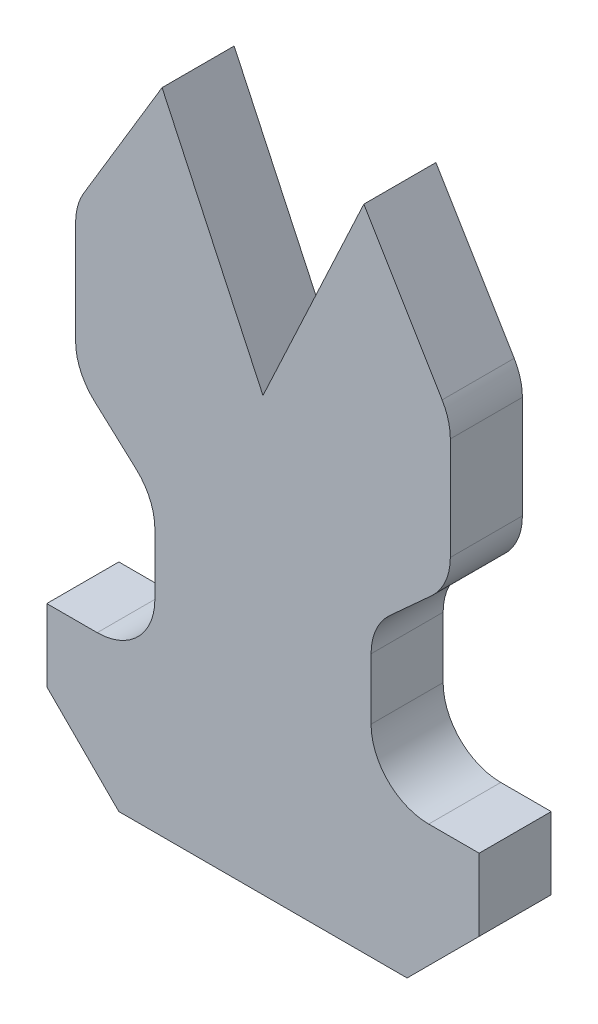
ISO-10303-21;
HEADER;
FILE_DESCRIPTION(('STEP AP214'),'2;1');
FILE_NAME('part.step','',(''),(''),'','','');
FILE_SCHEMA(('AUTOMOTIVE_DESIGN { 1 0 10303 214 1 1 1 1 }'));
ENDSEC;
DATA;
#1=APPLICATION_CONTEXT('core data for automotive mechanical design processes');
#2=APPLICATION_PROTOCOL_DEFINITION('international standard','automotive_design',2000,#1);
#3=PRODUCT_CONTEXT('',#1,'mechanical');
#4=PRODUCT('Part','Part','',(#3));
#5=PRODUCT_RELATED_PRODUCT_CATEGORY('part','',(#4));
#6=PRODUCT_DEFINITION_FORMATION('','',#4);
#7=PRODUCT_DEFINITION_CONTEXT('part definition',#1,'design');
#8=PRODUCT_DEFINITION('design','',#6,#7);
#9=PRODUCT_DEFINITION_SHAPE('','',#8);
#10=(LENGTH_UNIT() NAMED_UNIT(*) SI_UNIT(.MILLI.,.METRE.));
#11=(NAMED_UNIT(*) PLANE_ANGLE_UNIT() SI_UNIT($,.RADIAN.));
#12=(NAMED_UNIT(*) SI_UNIT($,.STERADIAN.) SOLID_ANGLE_UNIT());
#13=UNCERTAINTY_MEASURE_WITH_UNIT(LENGTH_MEASURE(1.E-05),#10,'distance_accuracy_value','');
#14=(GEOMETRIC_REPRESENTATION_CONTEXT(3) GLOBAL_UNCERTAINTY_ASSIGNED_CONTEXT((#13)) GLOBAL_UNIT_ASSIGNED_CONTEXT((#10,
#11,#12)) REPRESENTATION_CONTEXT('',''));
#15=CARTESIAN_POINT('',(0.,0.,0.));
#16=DIRECTION('',(0.,0.,1.));
#17=DIRECTION('',(1.,0.,0.));
#18=AXIS2_PLACEMENT_3D('',#15,#16,#17);
#19=CARTESIAN_POINT('',(1.15,-1.6,0.5));
#20=DIRECTION('',(0.,0.,-1.));
#21=DIRECTION('',(-1.,0.,0.));
#22=AXIS2_PLACEMENT_3D('',#19,#20,#21);
#23=CYLINDRICAL_SURFACE('',#22,0.4);
#24=CARTESIAN_POINT('',(1.15,-1.6,0.));
#25=DIRECTION('',(0.,0.,-1.));
#26=DIRECTION('',(-1.,0.,0.));
#27=AXIS2_PLACEMENT_3D('',#24,#25,#26);
#28=CIRCLE('',#27,0.4);
#29=CARTESIAN_POINT('',(1.15,-2.,0.));
#30=VERTEX_POINT('',#29);
#31=CARTESIAN_POINT('',(0.750000000000001,-1.6,0.));
#32=VERTEX_POINT('',#31);
#33=EDGE_CURVE('E230',#30,#32,#28,.T.);
#34=ORIENTED_EDGE('',*,*,#33,.T.);
#35=DIRECTION('',(0.,0.,-1.));
#36=VECTOR('',#35,1.);
#37=CARTESIAN_POINT('',(0.750000000000001,-1.6,0.5));
#38=LINE('',#37,#36);
#39=CARTESIAN_POINT('',(0.750000000000001,-1.6,0.5));
#40=VERTEX_POINT('',#39);
#41=EDGE_CURVE('E11',#40,#32,#38,.T.);
#42=ORIENTED_EDGE('',*,*,#41,.F.);
#43=CARTESIAN_POINT('',(1.15,-1.6,0.5));
#44=DIRECTION('',(0.,0.,-1.));
#45=DIRECTION('',(-1.,0.,0.));
#46=AXIS2_PLACEMENT_3D('',#43,#44,#45);
#47=CIRCLE('',#46,0.4);
#48=CARTESIAN_POINT('',(1.15,-2.,0.5));
#49=VERTEX_POINT('',#48);
#50=EDGE_CURVE('E278',#49,#40,#47,.T.);
#51=ORIENTED_EDGE('',*,*,#50,.F.);
#52=DIRECTION('',(0.,0.,-1.));
#53=VECTOR('',#52,1.);
#54=CARTESIAN_POINT('',(1.15,-2.,0.5));
#55=LINE('',#54,#53);
#56=EDGE_CURVE('E226',#49,#30,#55,.T.);
#57=ORIENTED_EDGE('',*,*,#56,.T.);
#58=EDGE_LOOP('',(#34,#42,#51,#57));
#59=FACE_BOUND('',#58,.T.);
#60=ADVANCED_FACE('F32',(#59),#23,.F.);
#61=CARTESIAN_POINT('',(0.750000000000001,-1.6,0.5));
#62=DIRECTION('',(-1.,0.,0.));
#63=DIRECTION('',(0.,0.,1.));
#64=AXIS2_PLACEMENT_3D('',#61,#62,#63);
#65=PLANE('',#64);
#66=DIRECTION('',(0.,1.,0.));
#67=VECTOR('',#66,1.);
#68=CARTESIAN_POINT('',(0.750000000000001,-1.6,0.));
#69=LINE('',#68,#67);
#70=CARTESIAN_POINT('',(0.750000000000001,-1.17694795444794,0.));
#71=VERTEX_POINT('',#70);
#72=EDGE_CURVE('E233',#32,#71,#69,.T.);
#73=ORIENTED_EDGE('',*,*,#72,.T.);
#74=DIRECTION('',(0.,0.,-1.));
#75=VECTOR('',#74,1.);
#76=CARTESIAN_POINT('',(0.750000000000001,-1.17694795444794,0.5));
#77=LINE('',#76,#75);
#78=CARTESIAN_POINT('',(0.750000000000001,-1.17694795444794,0.5));
#79=VERTEX_POINT('',#78);
#80=EDGE_CURVE('E40',#79,#71,#77,.T.);
#81=ORIENTED_EDGE('',*,*,#80,.F.);
#82=DIRECTION('',(0.,1.,0.));
#83=VECTOR('',#82,1.);
#84=CARTESIAN_POINT('',(0.750000000000001,-1.6,0.5));
#85=LINE('',#84,#83);
#86=EDGE_CURVE('E142',#40,#79,#85,.T.);
#87=ORIENTED_EDGE('',*,*,#86,.F.);
#88=ORIENTED_EDGE('',*,*,#41,.T.);
#89=EDGE_LOOP('',(#73,#81,#87,#88));
#90=FACE_BOUND('',#89,.T.);
#91=ADVANCED_FACE('F421',(#90),#65,.F.);
#92=CARTESIAN_POINT('',(1.15,-1.17694795444794,0.5));
#93=DIRECTION('',(0.,0.,-1.));
#94=DIRECTION('',(-1.,0.,0.));
#95=AXIS2_PLACEMENT_3D('',#92,#93,#94);
#96=CYLINDRICAL_SURFACE('',#95,0.4);
#97=CARTESIAN_POINT('',(1.15,-1.17694795444794,0.));
#98=DIRECTION('',(0.,0.,-1.));
#99=DIRECTION('',(-1.,0.,0.));
#100=AXIS2_PLACEMENT_3D('',#97,#98,#99);
#101=CIRCLE('',#100,0.4);
#102=CARTESIAN_POINT('',(0.880930882401476,-0.880971925089568,0.));
#103=VERTEX_POINT('',#102);
#104=EDGE_CURVE('E235',#71,#103,#101,.T.);
#105=ORIENTED_EDGE('',*,*,#104,.T.);
#106=DIRECTION('',(0.,0.,-1.));
#107=VECTOR('',#106,1.);
#108=CARTESIAN_POINT('',(0.880930882401476,-0.880971925089568,0.5));
#109=LINE('',#108,#107);
#110=CARTESIAN_POINT('',(0.880930882401476,-0.880971925089568,0.5));
#111=VERTEX_POINT('',#110);
#112=EDGE_CURVE('E336',#111,#103,#109,.T.);
#113=ORIENTED_EDGE('',*,*,#112,.F.);
#114=CARTESIAN_POINT('',(1.15,-1.17694795444794,0.5));
#115=DIRECTION('',(0.,0.,-1.));
#116=DIRECTION('',(-1.,0.,0.));
#117=AXIS2_PLACEMENT_3D('',#114,#115,#116);
#118=CIRCLE('',#117,0.4);
#119=EDGE_CURVE('E344',#79,#111,#118,.T.);
#120=ORIENTED_EDGE('',*,*,#119,.F.);
#121=ORIENTED_EDGE('',*,*,#80,.T.);
#122=EDGE_LOOP('',(#105,#113,#120,#121));
#123=FACE_BOUND('',#122,.T.);
#124=ADVANCED_FACE('F342',(#123),#96,.F.);
#125=CARTESIAN_POINT('',(0.880930882401476,-0.880971925089568,0.5));
#126=DIRECTION('',(-0.672672793996312,0.739940073395944,0.));
#127=DIRECTION('',(-0.739940073395944,-0.672672793996312,0.));
#128=AXIS2_PLACEMENT_3D('',#125,#126,#127);
#129=PLANE('',#128);
#130=DIRECTION('',(0.739940073395944,0.672672793996312,0.));
#131=VECTOR('',#130,1.);
#132=CARTESIAN_POINT('',(0.880930882401476,-0.880971925089568,0.));
#133=LINE('',#132,#131);
#134=CARTESIAN_POINT('',(1.16906911759853,-0.619028074910431,0.));
#135=VERTEX_POINT('',#134);
#136=EDGE_CURVE('E237',#103,#135,#133,.T.);
#137=ORIENTED_EDGE('',*,*,#136,.T.);
#138=DIRECTION('',(0.,0.,-1.));
#139=VECTOR('',#138,1.);
#140=CARTESIAN_POINT('',(1.16906911759853,-0.619028074910431,0.5));
#141=LINE('',#140,#139);
#142=CARTESIAN_POINT('',(1.16906911759853,-0.619028074910431,0.5));
#143=VERTEX_POINT('',#142);
#144=EDGE_CURVE('E333',#143,#135,#141,.T.);
#145=ORIENTED_EDGE('',*,*,#144,.F.);
#146=DIRECTION('',(0.739940073395944,0.672672793996312,0.));
#147=VECTOR('',#146,1.);
#148=CARTESIAN_POINT('',(0.880930882401476,-0.880971925089568,0.5));
#149=LINE('',#148,#147);
#150=EDGE_CURVE('E362',#111,#143,#149,.T.);
#151=ORIENTED_EDGE('',*,*,#150,.F.);
#152=ORIENTED_EDGE('',*,*,#112,.T.);
#153=EDGE_LOOP('',(#137,#145,#151,#152));
#154=FACE_BOUND('',#153,.T.);
#155=ADVANCED_FACE('F353',(#154),#129,.F.);
#156=CARTESIAN_POINT('',(0.9,-0.323052045552054,0.5));
#157=DIRECTION('',(0.,0.,-1.));
#158=DIRECTION('',(-1.,0.,0.));
#159=AXIS2_PLACEMENT_3D('',#156,#157,#158);
#160=CYLINDRICAL_SURFACE('',#159,0.4);
#161=CARTESIAN_POINT('',(0.9,-0.323052045552054,0.));
#162=DIRECTION('',(0.,0.,1.));
#163=DIRECTION('',(1.,0.,0.));
#164=AXIS2_PLACEMENT_3D('',#161,#162,#163);
#165=CIRCLE('',#164,0.4);
#166=CARTESIAN_POINT('',(1.3,-0.323052045552054,0.));
#167=VERTEX_POINT('',#166);
#168=EDGE_CURVE('E239',#135,#167,#165,.T.);
#169=ORIENTED_EDGE('',*,*,#168,.T.);
#170=DIRECTION('',(0.,0.,-1.));
#171=VECTOR('',#170,1.);
#172=CARTESIAN_POINT('',(1.3,-0.323052045552054,0.5));
#173=LINE('',#172,#171);
#174=CARTESIAN_POINT('',(1.3,-0.323052045552054,0.5));
#175=VERTEX_POINT('',#174);
#176=EDGE_CURVE('E330',#175,#167,#173,.T.);
#177=ORIENTED_EDGE('',*,*,#176,.F.);
#178=CARTESIAN_POINT('',(0.9,-0.323052045552054,0.5));
#179=DIRECTION('',(0.,0.,1.));
#180=DIRECTION('',(1.,0.,0.));
#181=AXIS2_PLACEMENT_3D('',#178,#179,#180);
#182=CIRCLE('',#181,0.4);
#183=EDGE_CURVE('E359',#143,#175,#182,.T.);
#184=ORIENTED_EDGE('',*,*,#183,.F.);
#185=ORIENTED_EDGE('',*,*,#144,.T.);
#186=EDGE_LOOP('',(#169,#177,#184,#185));
#187=FACE_BOUND('',#186,.T.);
#188=ADVANCED_FACE('F357',(#187),#160,.T.);
#189=CARTESIAN_POINT('',(1.3,-0.323052045552054,0.5));
#190=DIRECTION('',(-1.,0.,0.));
#191=DIRECTION('',(0.,0.,1.));
#192=AXIS2_PLACEMENT_3D('',#189,#190,#191);
#193=PLANE('',#192);
#194=DIRECTION('',(0.,1.,0.));
#195=VECTOR('',#194,1.);
#196=CARTESIAN_POINT('',(1.3,-0.323052045552054,0.));
#197=LINE('',#196,#195);
#198=CARTESIAN_POINT('',(1.3,0.389206414020627,0.));
#199=VERTEX_POINT('',#198);
#200=EDGE_CURVE('E241',#167,#199,#197,.T.);
#201=ORIENTED_EDGE('',*,*,#200,.T.);
#202=DIRECTION('',(0.,0.,-1.));
#203=VECTOR('',#202,1.);
#204=CARTESIAN_POINT('',(1.3,0.389206414020627,0.5));
#205=LINE('',#204,#203);
#206=CARTESIAN_POINT('',(1.3,0.389206414020627,0.5));
#207=VERTEX_POINT('',#206);
#208=EDGE_CURVE('E327',#207,#199,#205,.T.);
#209=ORIENTED_EDGE('',*,*,#208,.F.);
#210=DIRECTION('',(0.,1.,0.));
#211=VECTOR('',#210,1.);
#212=CARTESIAN_POINT('',(1.3,-0.323052045552054,0.5));
#213=LINE('',#212,#211);
#214=EDGE_CURVE('E361',#175,#207,#213,.T.);
#215=ORIENTED_EDGE('',*,*,#214,.F.);
#216=ORIENTED_EDGE('',*,*,#176,.T.);
#217=EDGE_LOOP('',(#201,#209,#215,#216));
#218=FACE_BOUND('',#217,.T.);
#219=ADVANCED_FACE('F434',(#218),#193,.F.);
#220=CARTESIAN_POINT('',(0.9,0.389206414020627,0.5));
#221=DIRECTION('',(0.,0.,-1.));
#222=DIRECTION('',(-1.,0.,0.));
#223=AXIS2_PLACEMENT_3D('',#220,#221,#222);
#224=CYLINDRICAL_SURFACE('',#223,0.4);
#225=CARTESIAN_POINT('',(0.9,0.389206414020627,0.));
#226=DIRECTION('',(0.,0.,1.));
#227=DIRECTION('',(1.,0.,0.));
#228=AXIS2_PLACEMENT_3D('',#225,#226,#227);
#229=CIRCLE('',#228,0.4);
#230=CARTESIAN_POINT('',(1.24299717028502,0.595004716191637,0.));
#231=VERTEX_POINT('',#230);
#232=EDGE_CURVE('E243',#199,#231,#229,.T.);
#233=ORIENTED_EDGE('',*,*,#232,.T.);
#234=DIRECTION('',(0.,0.,-1.));
#235=VECTOR('',#234,1.);
#236=CARTESIAN_POINT('',(1.24299717028502,0.595004716191637,0.5));
#237=LINE('',#236,#235);
#238=CARTESIAN_POINT('',(1.24299717028502,0.595004716191637,0.5));
#239=VERTEX_POINT('',#238);
#240=EDGE_CURVE('E324',#239,#231,#237,.T.);
#241=ORIENTED_EDGE('',*,*,#240,.F.);
#242=CARTESIAN_POINT('',(0.9,0.389206414020627,0.5));
#243=DIRECTION('',(0.,0.,1.));
#244=DIRECTION('',(1.,0.,0.));
#245=AXIS2_PLACEMENT_3D('',#242,#243,#244);
#246=CIRCLE('',#245,0.4);
#247=EDGE_CURVE('E364',#207,#239,#246,.T.);
#248=ORIENTED_EDGE('',*,*,#247,.F.);
#249=ORIENTED_EDGE('',*,*,#208,.T.);
#250=EDGE_LOOP('',(#233,#241,#248,#249));
#251=FACE_BOUND('',#250,.T.);
#252=ADVANCED_FACE('F437',(#251),#224,.T.);
#253=CARTESIAN_POINT('',(1.24299717028502,0.595004716191637,0.5));
#254=DIRECTION('',(-0.857492925712544,-0.514495755427527,0.));
#255=DIRECTION('',(0.514495755427527,-0.857492925712544,0.));
#256=AXIS2_PLACEMENT_3D('',#253,#254,#255);
#257=PLANE('',#256);
#258=DIRECTION('',(-0.514495755427527,0.857492925712544,0.));
#259=VECTOR('',#258,1.);
#260=CARTESIAN_POINT('',(1.24299717028502,0.595004716191637,0.));
#261=LINE('',#260,#259);
#262=CARTESIAN_POINT('',(0.7,1.5,0.));
#263=VERTEX_POINT('',#262);
#264=EDGE_CURVE('E245',#231,#263,#261,.T.);
#265=ORIENTED_EDGE('',*,*,#264,.T.);
#266=DIRECTION('',(0.,0.,-1.));
#267=VECTOR('',#266,1.);
#268=CARTESIAN_POINT('',(0.7,1.5,0.5));
#269=LINE('',#268,#267);
#270=CARTESIAN_POINT('',(0.7,1.5,0.5));
#271=VERTEX_POINT('',#270);
#272=EDGE_CURVE('E321',#271,#263,#269,.T.);
#273=ORIENTED_EDGE('',*,*,#272,.F.);
#274=DIRECTION('',(-0.514495755427527,0.857492925712544,0.));
#275=VECTOR('',#274,1.);
#276=CARTESIAN_POINT('',(1.24299717028502,0.595004716191637,0.5));
#277=LINE('',#276,#275);
#278=EDGE_CURVE('E370',#239,#271,#277,.T.);
#279=ORIENTED_EDGE('',*,*,#278,.F.);
#280=ORIENTED_EDGE('',*,*,#240,.T.);
#281=EDGE_LOOP('',(#265,#273,#279,#280));
#282=FACE_BOUND('',#281,.T.);
#283=ADVANCED_FACE('F441',(#282),#257,.F.);
#284=CARTESIAN_POINT('',(0.7,1.5,0.5));
#285=DIRECTION('',(0.906183139995266,-0.422885465331124,0.));
#286=DIRECTION('',(0.422885465331124,0.906183139995266,0.));
#287=AXIS2_PLACEMENT_3D('',#284,#285,#286);
#288=PLANE('',#287);
#289=DIRECTION('',(-0.422885465331124,-0.906183139995266,0.));
#290=VECTOR('',#289,1.);
#291=CARTESIAN_POINT('',(0.7,1.5,0.));
#292=LINE('',#291,#290);
#293=CARTESIAN_POINT('',(0.,0.,0.));
#294=VERTEX_POINT('',#293);
#295=EDGE_CURVE('E247',#263,#294,#292,.T.);
#296=ORIENTED_EDGE('',*,*,#295,.T.);
#297=DIRECTION('',(0.,0.,-1.));
#298=VECTOR('',#297,1.);
#299=CARTESIAN_POINT('',(0.,0.,0.5));
#300=LINE('',#299,#298);
#301=CARTESIAN_POINT('',(0.,0.,0.5));
#302=VERTEX_POINT('',#301);
#303=EDGE_CURVE('E318',#302,#294,#300,.T.);
#304=ORIENTED_EDGE('',*,*,#303,.F.);
#305=DIRECTION('',(-0.422885465331124,-0.906183139995266,0.));
#306=VECTOR('',#305,1.);
#307=CARTESIAN_POINT('',(0.7,1.5,0.5));
#308=LINE('',#307,#306);
#309=EDGE_CURVE('E372',#271,#302,#308,.T.);
#310=ORIENTED_EDGE('',*,*,#309,.F.);
#311=ORIENTED_EDGE('',*,*,#272,.T.);
#312=EDGE_LOOP('',(#296,#304,#310,#311));
#313=FACE_BOUND('',#312,.T.);
#314=ADVANCED_FACE('F445',(#313),#288,.F.);
#315=CARTESIAN_POINT('',(-0.7,1.5,0.5));
#316=DIRECTION('',(-0.906183139995266,-0.422885465331124,0.));
#317=DIRECTION('',(0.422885465331124,-0.906183139995266,0.));
#318=AXIS2_PLACEMENT_3D('',#315,#316,#317);
#319=PLANE('',#318);
#320=DIRECTION('',(-0.422885465331124,0.906183139995266,0.));
#321=VECTOR('',#320,1.);
#322=CARTESIAN_POINT('',(-0.7,1.5,0.));
#323=LINE('',#322,#321);
#324=CARTESIAN_POINT('',(-0.7,1.5,0.));
#325=VERTEX_POINT('',#324);
#326=EDGE_CURVE('E249',#294,#325,#323,.T.);
#327=ORIENTED_EDGE('',*,*,#326,.T.);
#328=DIRECTION('',(0.,0.,-1.));
#329=VECTOR('',#328,1.);
#330=CARTESIAN_POINT('',(-0.7,1.5,0.5));
#331=LINE('',#330,#329);
#332=CARTESIAN_POINT('',(-0.7,1.5,0.5));
#333=VERTEX_POINT('',#332);
#334=EDGE_CURVE('E315',#333,#325,#331,.T.);
#335=ORIENTED_EDGE('',*,*,#334,.F.);
#336=DIRECTION('',(-0.422885465331124,0.906183139995266,0.));
#337=VECTOR('',#336,1.);
#338=CARTESIAN_POINT('',(-0.7,1.5,0.5));
#339=LINE('',#338,#337);
#340=EDGE_CURVE('E374',#302,#333,#339,.T.);
#341=ORIENTED_EDGE('',*,*,#340,.F.);
#342=ORIENTED_EDGE('',*,*,#303,.T.);
#343=EDGE_LOOP('',(#327,#335,#341,#342));
#344=FACE_BOUND('',#343,.T.);
#345=ADVANCED_FACE('F449',(#344),#319,.F.);
#346=CARTESIAN_POINT('',(-1.24299717028502,0.595004716191637,0.5));
#347=DIRECTION('',(0.857492925712544,-0.514495755427527,0.));
#348=DIRECTION('',(0.514495755427527,0.857492925712544,0.));
#349=AXIS2_PLACEMENT_3D('',#346,#347,#348);
#350=PLANE('',#349);
#351=DIRECTION('',(-0.514495755427527,-0.857492925712544,0.));
#352=VECTOR('',#351,1.);
#353=CARTESIAN_POINT('',(-1.24299717028502,0.595004716191637,0.));
#354=LINE('',#353,#352);
#355=CARTESIAN_POINT('',(-1.24299717028502,0.595004716191637,0.));
#356=VERTEX_POINT('',#355);
#357=EDGE_CURVE('E251',#325,#356,#354,.T.);
#358=ORIENTED_EDGE('',*,*,#357,.T.);
#359=DIRECTION('',(0.,0.,-1.));
#360=VECTOR('',#359,1.);
#361=CARTESIAN_POINT('',(-1.24299717028502,0.595004716191637,0.5));
#362=LINE('',#361,#360);
#363=CARTESIAN_POINT('',(-1.24299717028502,0.595004716191637,0.5));
#364=VERTEX_POINT('',#363);
#365=EDGE_CURVE('E312',#364,#356,#362,.T.);
#366=ORIENTED_EDGE('',*,*,#365,.F.);
#367=DIRECTION('',(-0.514495755427527,-0.857492925712544,0.));
#368=VECTOR('',#367,1.);
#369=CARTESIAN_POINT('',(-1.24299717028502,0.595004716191637,0.5));
#370=LINE('',#369,#368);
#371=EDGE_CURVE('E376',#333,#364,#370,.T.);
#372=ORIENTED_EDGE('',*,*,#371,.F.);
#373=ORIENTED_EDGE('',*,*,#334,.T.);
#374=EDGE_LOOP('',(#358,#366,#372,#373));
#375=FACE_BOUND('',#374,.T.);
#376=ADVANCED_FACE('F453',(#375),#350,.F.);
#377=CARTESIAN_POINT('',(-0.9,0.389206414020626,0.5));
#378=DIRECTION('',(0.,0.,-1.));
#379=DIRECTION('',(-1.,0.,0.));
#380=AXIS2_PLACEMENT_3D('',#377,#378,#379);
#381=CYLINDRICAL_SURFACE('',#380,0.4);
#382=CARTESIAN_POINT('',(-0.9,0.389206414020626,0.));
#383=DIRECTION('',(0.,0.,1.));
#384=DIRECTION('',(-1.,0.,0.));
#385=AXIS2_PLACEMENT_3D('',#382,#383,#384);
#386=CIRCLE('',#385,0.4);
#387=CARTESIAN_POINT('',(-1.3,0.389206414020626,0.));
#388=VERTEX_POINT('',#387);
#389=EDGE_CURVE('E253',#356,#388,#386,.T.);
#390=ORIENTED_EDGE('',*,*,#389,.T.);
#391=DIRECTION('',(0.,0.,-1.));
#392=VECTOR('',#391,1.);
#393=CARTESIAN_POINT('',(-1.3,0.389206414020626,0.5));
#394=LINE('',#393,#392);
#395=CARTESIAN_POINT('',(-1.3,0.389206414020626,0.5));
#396=VERTEX_POINT('',#395);
#397=EDGE_CURVE('E309',#396,#388,#394,.T.);
#398=ORIENTED_EDGE('',*,*,#397,.F.);
#399=CARTESIAN_POINT('',(-0.9,0.389206414020626,0.5));
#400=DIRECTION('',(0.,0.,1.));
#401=DIRECTION('',(-1.,0.,0.));
#402=AXIS2_PLACEMENT_3D('',#399,#400,#401);
#403=CIRCLE('',#402,0.4);
#404=EDGE_CURVE('E378',#364,#396,#403,.T.);
#405=ORIENTED_EDGE('',*,*,#404,.F.);
#406=ORIENTED_EDGE('',*,*,#365,.T.);
#407=EDGE_LOOP('',(#390,#398,#405,#406));
#408=FACE_BOUND('',#407,.T.);
#409=ADVANCED_FACE('F457',(#408),#381,.T.);
#410=CARTESIAN_POINT('',(-1.3,-0.323052045552054,0.5));
#411=DIRECTION('',(1.,0.,0.));
#412=DIRECTION('',(0.,0.,-1.));
#413=AXIS2_PLACEMENT_3D('',#410,#411,#412);
#414=PLANE('',#413);
#415=DIRECTION('',(0.,-1.,0.));
#416=VECTOR('',#415,1.);
#417=CARTESIAN_POINT('',(-1.3,-0.323052045552054,0.));
#418=LINE('',#417,#416);
#419=CARTESIAN_POINT('',(-1.3,-0.323052045552054,0.));
#420=VERTEX_POINT('',#419);
#421=EDGE_CURVE('E255',#388,#420,#418,.T.);
#422=ORIENTED_EDGE('',*,*,#421,.T.);
#423=DIRECTION('',(0.,0.,-1.));
#424=VECTOR('',#423,1.);
#425=CARTESIAN_POINT('',(-1.3,-0.323052045552054,0.5));
#426=LINE('',#425,#424);
#427=CARTESIAN_POINT('',(-1.3,-0.323052045552054,0.5));
#428=VERTEX_POINT('',#427);
#429=EDGE_CURVE('E306',#428,#420,#426,.T.);
#430=ORIENTED_EDGE('',*,*,#429,.F.);
#431=DIRECTION('',(0.,-1.,0.));
#432=VECTOR('',#431,1.);
#433=CARTESIAN_POINT('',(-1.3,-0.323052045552054,0.5));
#434=LINE('',#433,#432);
#435=EDGE_CURVE('E380',#396,#428,#434,.T.);
#436=ORIENTED_EDGE('',*,*,#435,.F.);
#437=ORIENTED_EDGE('',*,*,#397,.T.);
#438=EDGE_LOOP('',(#422,#430,#436,#437));
#439=FACE_BOUND('',#438,.T.);
#440=ADVANCED_FACE('F461',(#439),#414,.F.);
#441=CARTESIAN_POINT('',(-0.9,-0.323052045552054,0.5));
#442=DIRECTION('',(0.,0.,-1.));
#443=DIRECTION('',(-1.,0.,0.));
#444=AXIS2_PLACEMENT_3D('',#441,#442,#443);
#445=CYLINDRICAL_SURFACE('',#444,0.4);
#446=CARTESIAN_POINT('',(-0.9,-0.323052045552054,0.));
#447=DIRECTION('',(0.,0.,1.));
#448=DIRECTION('',(-1.,0.,0.));
#449=AXIS2_PLACEMENT_3D('',#446,#447,#448);
#450=CIRCLE('',#449,0.4);
#451=CARTESIAN_POINT('',(-1.16906911759853,-0.619028074910431,0.));
#452=VERTEX_POINT('',#451);
#453=EDGE_CURVE('E257',#420,#452,#450,.T.);
#454=ORIENTED_EDGE('',*,*,#453,.T.);
#455=DIRECTION('',(0.,0.,-1.));
#456=VECTOR('',#455,1.);
#457=CARTESIAN_POINT('',(-1.16906911759853,-0.619028074910431,0.5));
#458=LINE('',#457,#456);
#459=CARTESIAN_POINT('',(-1.16906911759853,-0.619028074910431,0.5));
#460=VERTEX_POINT('',#459);
#461=EDGE_CURVE('E303',#460,#452,#458,.T.);
#462=ORIENTED_EDGE('',*,*,#461,.F.);
#463=CARTESIAN_POINT('',(-0.9,-0.323052045552054,0.5));
#464=DIRECTION('',(0.,0.,1.));
#465=DIRECTION('',(-1.,0.,0.));
#466=AXIS2_PLACEMENT_3D('',#463,#464,#465);
#467=CIRCLE('',#466,0.4);
#468=EDGE_CURVE('E382',#428,#460,#467,.T.);
#469=ORIENTED_EDGE('',*,*,#468,.F.);
#470=ORIENTED_EDGE('',*,*,#429,.T.);
#471=EDGE_LOOP('',(#454,#462,#469,#470));
#472=FACE_BOUND('',#471,.T.);
#473=ADVANCED_FACE('F465',(#472),#445,.T.);
#474=CARTESIAN_POINT('',(-0.880930882401475,-0.880971925089568,0.5));
#475=DIRECTION('',(0.672672793996312,0.739940073395944,0.));
#476=DIRECTION('',(-0.739940073395944,0.672672793996312,0.));
#477=AXIS2_PLACEMENT_3D('',#474,#475,#476);
#478=PLANE('',#477);
#479=DIRECTION('',(0.739940073395944,-0.672672793996312,0.));
#480=VECTOR('',#479,1.);
#481=CARTESIAN_POINT('',(-0.880930882401475,-0.880971925089568,0.));
#482=LINE('',#481,#480);
#483=CARTESIAN_POINT('',(-0.880930882401475,-0.880971925089568,0.));
#484=VERTEX_POINT('',#483);
#485=EDGE_CURVE('E259',#452,#484,#482,.T.);
#486=ORIENTED_EDGE('',*,*,#485,.T.);
#487=DIRECTION('',(0.,0.,-1.));
#488=VECTOR('',#487,1.);
#489=CARTESIAN_POINT('',(-0.880930882401475,-0.880971925089568,0.5));
#490=LINE('',#489,#488);
#491=CARTESIAN_POINT('',(-0.880930882401475,-0.880971925089568,0.5));
#492=VERTEX_POINT('',#491);
#493=EDGE_CURVE('E300',#492,#484,#490,.T.);
#494=ORIENTED_EDGE('',*,*,#493,.F.);
#495=DIRECTION('',(0.739940073395944,-0.672672793996312,0.));
#496=VECTOR('',#495,1.);
#497=CARTESIAN_POINT('',(-0.880930882401475,-0.880971925089568,0.5));
#498=LINE('',#497,#496);
#499=EDGE_CURVE('E384',#460,#492,#498,.T.);
#500=ORIENTED_EDGE('',*,*,#499,.F.);
#501=ORIENTED_EDGE('',*,*,#461,.T.);
#502=EDGE_LOOP('',(#486,#494,#500,#501));
#503=FACE_BOUND('',#502,.T.);
#504=ADVANCED_FACE('F469',(#503),#478,.F.);
#505=CARTESIAN_POINT('',(-1.15,-1.17694795444794,0.5));
#506=DIRECTION('',(0.,0.,-1.));
#507=DIRECTION('',(-1.,0.,0.));
#508=AXIS2_PLACEMENT_3D('',#505,#506,#507);
#509=CYLINDRICAL_SURFACE('',#508,0.4);
#510=CARTESIAN_POINT('',(-1.15,-1.17694795444794,0.));
#511=DIRECTION('',(0.,0.,-1.));
#512=DIRECTION('',(1.,0.,0.));
#513=AXIS2_PLACEMENT_3D('',#510,#511,#512);
#514=CIRCLE('',#513,0.4);
#515=CARTESIAN_POINT('',(-0.75,-1.17694795444794,0.));
#516=VERTEX_POINT('',#515);
#517=EDGE_CURVE('E261',#484,#516,#514,.T.);
#518=ORIENTED_EDGE('',*,*,#517,.T.);
#519=DIRECTION('',(0.,0.,-1.));
#520=VECTOR('',#519,1.);
#521=CARTESIAN_POINT('',(-0.75,-1.17694795444794,0.5));
#522=LINE('',#521,#520);
#523=CARTESIAN_POINT('',(-0.75,-1.17694795444794,0.5));
#524=VERTEX_POINT('',#523);
#525=EDGE_CURVE('E297',#524,#516,#522,.T.);
#526=ORIENTED_EDGE('',*,*,#525,.F.);
#527=CARTESIAN_POINT('',(-1.15,-1.17694795444794,0.5));
#528=DIRECTION('',(0.,0.,-1.));
#529=DIRECTION('',(1.,0.,0.));
#530=AXIS2_PLACEMENT_3D('',#527,#528,#529);
#531=CIRCLE('',#530,0.4);
#532=EDGE_CURVE('E386',#492,#524,#531,.T.);
#533=ORIENTED_EDGE('',*,*,#532,.F.);
#534=ORIENTED_EDGE('',*,*,#493,.T.);
#535=EDGE_LOOP('',(#518,#526,#533,#534));
#536=FACE_BOUND('',#535,.T.);
#537=ADVANCED_FACE('F473',(#536),#509,.F.);
#538=CARTESIAN_POINT('',(-0.75,-1.6,0.5));
#539=DIRECTION('',(1.,0.,0.));
#540=DIRECTION('',(0.,0.,-1.));
#541=AXIS2_PLACEMENT_3D('',#538,#539,#540);
#542=PLANE('',#541);
#543=DIRECTION('',(0.,-1.,0.));
#544=VECTOR('',#543,1.);
#545=CARTESIAN_POINT('',(-0.75,-1.6,0.));
#546=LINE('',#545,#544);
#547=CARTESIAN_POINT('',(-0.75,-1.6,0.));
#548=VERTEX_POINT('',#547);
#549=EDGE_CURVE('E263',#516,#548,#546,.T.);
#550=ORIENTED_EDGE('',*,*,#549,.T.);
#551=DIRECTION('',(0.,0.,-1.));
#552=VECTOR('',#551,1.);
#553=CARTESIAN_POINT('',(-0.75,-1.6,0.5));
#554=LINE('',#553,#552);
#555=CARTESIAN_POINT('',(-0.75,-1.6,0.5));
#556=VERTEX_POINT('',#555);
#557=EDGE_CURVE('E294',#556,#548,#554,.T.);
#558=ORIENTED_EDGE('',*,*,#557,.F.);
#559=DIRECTION('',(0.,-1.,0.));
#560=VECTOR('',#559,1.);
#561=CARTESIAN_POINT('',(-0.75,-1.6,0.5));
#562=LINE('',#561,#560);
#563=EDGE_CURVE('E388',#524,#556,#562,.T.);
#564=ORIENTED_EDGE('',*,*,#563,.F.);
#565=ORIENTED_EDGE('',*,*,#525,.T.);
#566=EDGE_LOOP('',(#550,#558,#564,#565));
#567=FACE_BOUND('',#566,.T.);
#568=ADVANCED_FACE('F477',(#567),#542,.F.);
#569=CARTESIAN_POINT('',(-1.15,-1.6,0.5));
#570=DIRECTION('',(0.,0.,-1.));
#571=DIRECTION('',(-1.,0.,0.));
#572=AXIS2_PLACEMENT_3D('',#569,#570,#571);
#573=CYLINDRICAL_SURFACE('',#572,0.4);
#574=CARTESIAN_POINT('',(-1.15,-1.6,0.));
#575=DIRECTION('',(0.,0.,-1.));
#576=DIRECTION('',(1.,0.,0.));
#577=AXIS2_PLACEMENT_3D('',#574,#575,#576);
#578=CIRCLE('',#577,0.4);
#579=CARTESIAN_POINT('',(-1.15,-2.,0.));
#580=VERTEX_POINT('',#579);
#581=EDGE_CURVE('E265',#548,#580,#578,.T.);
#582=ORIENTED_EDGE('',*,*,#581,.T.);
#583=DIRECTION('',(0.,0.,-1.));
#584=VECTOR('',#583,1.);
#585=CARTESIAN_POINT('',(-1.15,-2.,0.5));
#586=LINE('',#585,#584);
#587=CARTESIAN_POINT('',(-1.15,-2.,0.5));
#588=VERTEX_POINT('',#587);
#589=EDGE_CURVE('E291',#588,#580,#586,.T.);
#590=ORIENTED_EDGE('',*,*,#589,.F.);
#591=CARTESIAN_POINT('',(-1.15,-1.6,0.5));
#592=DIRECTION('',(0.,0.,-1.));
#593=DIRECTION('',(1.,0.,0.));
#594=AXIS2_PLACEMENT_3D('',#591,#592,#593);
#595=CIRCLE('',#594,0.4);
#596=EDGE_CURVE('E390',#556,#588,#595,.T.);
#597=ORIENTED_EDGE('',*,*,#596,.F.);
#598=ORIENTED_EDGE('',*,*,#557,.T.);
#599=EDGE_LOOP('',(#582,#590,#597,#598));
#600=FACE_BOUND('',#599,.T.);
#601=ADVANCED_FACE('F481',(#600),#573,.F.);
#602=CARTESIAN_POINT('',(-1.5,-2.,0.5));
#603=DIRECTION('',(0.,-1.,0.));
#604=DIRECTION('',(0.,0.,-1.));
#605=AXIS2_PLACEMENT_3D('',#602,#603,#604);
#606=PLANE('',#605);
#607=DIRECTION('',(-1.,0.,0.));
#608=VECTOR('',#607,1.);
#609=CARTESIAN_POINT('',(-1.5,-2.,0.));
#610=LINE('',#609,#608);
#611=CARTESIAN_POINT('',(-1.5,-2.,0.));
#612=VERTEX_POINT('',#611);
#613=EDGE_CURVE('E267',#580,#612,#610,.T.);
#614=ORIENTED_EDGE('',*,*,#613,.T.);
#615=DIRECTION('',(0.,0.,-1.));
#616=VECTOR('',#615,1.);
#617=CARTESIAN_POINT('',(-1.5,-2.,0.5));
#618=LINE('',#617,#616);
#619=CARTESIAN_POINT('',(-1.5,-2.,0.5));
#620=VERTEX_POINT('',#619);
#621=EDGE_CURVE('E288',#620,#612,#618,.T.);
#622=ORIENTED_EDGE('',*,*,#621,.F.);
#623=DIRECTION('',(-1.,0.,0.));
#624=VECTOR('',#623,1.);
#625=CARTESIAN_POINT('',(-1.5,-2.,0.5));
#626=LINE('',#625,#624);
#627=EDGE_CURVE('E392',#588,#620,#626,.T.);
#628=ORIENTED_EDGE('',*,*,#627,.F.);
#629=ORIENTED_EDGE('',*,*,#589,.T.);
#630=EDGE_LOOP('',(#614,#622,#628,#629));
#631=FACE_BOUND('',#630,.T.);
#632=ADVANCED_FACE('F485',(#631),#606,.F.);
#633=CARTESIAN_POINT('',(-1.5,-2.5,0.5));
#634=DIRECTION('',(1.,0.,0.));
#635=DIRECTION('',(0.,1.,0.));
#636=AXIS2_PLACEMENT_3D('',#633,#634,#635);
#637=PLANE('',#636);
#638=DIRECTION('',(0.,-1.,0.));
#639=VECTOR('',#638,1.);
#640=CARTESIAN_POINT('',(-1.5,-2.5,0.));
#641=LINE('',#640,#639);
#642=CARTESIAN_POINT('',(-1.5,-2.5,0.));
#643=VERTEX_POINT('',#642);
#644=EDGE_CURVE('E269',#612,#643,#641,.T.);
#645=ORIENTED_EDGE('',*,*,#644,.T.);
#646=DIRECTION('',(0.,0.,-1.));
#647=VECTOR('',#646,1.);
#648=CARTESIAN_POINT('',(-1.5,-2.5,0.5));
#649=LINE('',#648,#647);
#650=CARTESIAN_POINT('',(-1.5,-2.5,0.5));
#651=VERTEX_POINT('',#650);
#652=EDGE_CURVE('E285',#651,#643,#649,.T.);
#653=ORIENTED_EDGE('',*,*,#652,.F.);
#654=DIRECTION('',(0.,-1.,0.));
#655=VECTOR('',#654,1.);
#656=CARTESIAN_POINT('',(-1.5,-2.5,0.5));
#657=LINE('',#656,#655);
#658=EDGE_CURVE('E394',#620,#651,#657,.T.);
#659=ORIENTED_EDGE('',*,*,#658,.F.);
#660=ORIENTED_EDGE('',*,*,#621,.T.);
#661=EDGE_LOOP('',(#645,#653,#659,#660));
#662=FACE_BOUND('',#661,.T.);
#663=ADVANCED_FACE('F489',(#662),#637,.F.);
#664=CARTESIAN_POINT('',(-0.999999999999999,-3.,0.5));
#665=DIRECTION('',(0.707106781186547,0.707106781186547,0.));
#666=DIRECTION('',(-0.707106781186548,0.707106781186548,0.));
#667=AXIS2_PLACEMENT_3D('',#664,#665,#666);
#668=PLANE('',#667);
#669=DIRECTION('',(0.707106781186548,-0.707106781186548,0.));
#670=VECTOR('',#669,1.);
#671=CARTESIAN_POINT('',(-0.999999999999999,-3.,0.));
#672=LINE('',#671,#670);
#673=CARTESIAN_POINT('',(-0.999999999999999,-3.,0.));
#674=VERTEX_POINT('',#673);
#675=EDGE_CURVE('E271',#643,#674,#672,.T.);
#676=ORIENTED_EDGE('',*,*,#675,.T.);
#677=DIRECTION('',(0.,0.,-1.));
#678=VECTOR('',#677,1.);
#679=CARTESIAN_POINT('',(-0.999999999999999,-3.,0.5));
#680=LINE('',#679,#678);
#681=CARTESIAN_POINT('',(-0.999999999999999,-3.,0.5));
#682=VERTEX_POINT('',#681);
#683=EDGE_CURVE('E282',#682,#674,#680,.T.);
#684=ORIENTED_EDGE('',*,*,#683,.F.);
#685=DIRECTION('',(0.707106781186548,-0.707106781186548,0.));
#686=VECTOR('',#685,1.);
#687=CARTESIAN_POINT('',(-0.999999999999999,-3.,0.5));
#688=LINE('',#687,#686);
#689=EDGE_CURVE('E396',#651,#682,#688,.T.);
#690=ORIENTED_EDGE('',*,*,#689,.F.);
#691=ORIENTED_EDGE('',*,*,#652,.T.);
#692=EDGE_LOOP('',(#676,#684,#690,#691));
#693=FACE_BOUND('',#692,.T.);
#694=ADVANCED_FACE('F402',(#693),#668,.F.);
#695=CARTESIAN_POINT('',(-0.999999999999999,-3.,0.5));
#696=DIRECTION('',(0.,1.,0.));
#697=DIRECTION('',(0.,0.,1.));
#698=AXIS2_PLACEMENT_3D('',#695,#696,#697);
#699=PLANE('',#698);
#700=DIRECTION('',(1.,0.,0.));
#701=VECTOR('',#700,1.);
#702=CARTESIAN_POINT('',(-0.999999999999999,-3.,0.));
#703=LINE('',#702,#701);
#704=CARTESIAN_POINT('',(1.,-3.,0.));
#705=VERTEX_POINT('',#704);
#706=EDGE_CURVE('E273',#674,#705,#703,.T.);
#707=ORIENTED_EDGE('',*,*,#706,.T.);
#708=DIRECTION('',(0.,0.,-1.));
#709=VECTOR('',#708,1.);
#710=CARTESIAN_POINT('',(1.,-3.,0.5));
#711=LINE('',#710,#709);
#712=CARTESIAN_POINT('',(1.,-3.,0.5));
#713=VERTEX_POINT('',#712);
#714=EDGE_CURVE('E221',#713,#705,#711,.T.);
#715=ORIENTED_EDGE('',*,*,#714,.F.);
#716=DIRECTION('',(1.,0.,0.));
#717=VECTOR('',#716,1.);
#718=CARTESIAN_POINT('',(-0.999999999999999,-3.,0.5));
#719=LINE('',#718,#717);
#720=EDGE_CURVE('E212',#682,#713,#719,.T.);
#721=ORIENTED_EDGE('',*,*,#720,.F.);
#722=ORIENTED_EDGE('',*,*,#683,.T.);
#723=EDGE_LOOP('',(#707,#715,#721,#722));
#724=FACE_BOUND('',#723,.T.);
#725=ADVANCED_FACE('F406',(#724),#699,.F.);
#726=CARTESIAN_POINT('',(1.,-3.,0.5));
#727=DIRECTION('',(-0.707106781186547,0.707106781186547,0.));
#728=DIRECTION('',(-0.707106781186548,-0.707106781186548,0.));
#729=AXIS2_PLACEMENT_3D('',#726,#727,#728);
#730=PLANE('',#729);
#731=DIRECTION('',(0.707106781186548,0.707106781186548,0.));
#732=VECTOR('',#731,1.);
#733=CARTESIAN_POINT('',(1.,-3.,0.));
#734=LINE('',#733,#732);
#735=CARTESIAN_POINT('',(1.5,-2.5,0.));
#736=VERTEX_POINT('',#735);
#737=EDGE_CURVE('E220',#705,#736,#734,.T.);
#738=ORIENTED_EDGE('',*,*,#737,.T.);
#739=DIRECTION('',(0.,0.,-1.));
#740=VECTOR('',#739,1.);
#741=CARTESIAN_POINT('',(1.5,-2.5,0.5));
#742=LINE('',#741,#740);
#743=CARTESIAN_POINT('',(1.5,-2.5,0.5));
#744=VERTEX_POINT('',#743);
#745=EDGE_CURVE('E217',#744,#736,#742,.T.);
#746=ORIENTED_EDGE('',*,*,#745,.F.);
#747=DIRECTION('',(0.707106781186548,0.707106781186548,0.));
#748=VECTOR('',#747,1.);
#749=CARTESIAN_POINT('',(1.,-3.,0.5));
#750=LINE('',#749,#748);
#751=EDGE_CURVE('E206',#713,#744,#750,.T.);
#752=ORIENTED_EDGE('',*,*,#751,.F.);
#753=ORIENTED_EDGE('',*,*,#714,.T.);
#754=EDGE_LOOP('',(#738,#746,#752,#753));
#755=FACE_BOUND('',#754,.T.);
#756=ADVANCED_FACE('F218',(#755),#730,.F.);
#757=CARTESIAN_POINT('',(1.5,-2.5,0.5));
#758=DIRECTION('',(-1.,0.,0.));
#759=DIRECTION('',(0.,0.,1.));
#760=AXIS2_PLACEMENT_3D('',#757,#758,#759);
#761=PLANE('',#760);
#762=DIRECTION('',(0.,1.,0.));
#763=VECTOR('',#762,1.);
#764=CARTESIAN_POINT('',(1.5,-2.5,0.));
#765=LINE('',#764,#763);
#766=CARTESIAN_POINT('',(1.5,-2.,0.));
#767=VERTEX_POINT('',#766);
#768=EDGE_CURVE('E128',#736,#767,#765,.T.);
#769=ORIENTED_EDGE('',*,*,#768,.T.);
#770=DIRECTION('',(0.,0.,-1.));
#771=VECTOR('',#770,1.);
#772=CARTESIAN_POINT('',(1.5,-2.,0.5));
#773=LINE('',#772,#771);
#774=CARTESIAN_POINT('',(1.5,-2.,0.5));
#775=VERTEX_POINT('',#774);
#776=EDGE_CURVE('E222',#775,#767,#773,.T.);
#777=ORIENTED_EDGE('',*,*,#776,.F.);
#778=DIRECTION('',(0.,1.,0.));
#779=VECTOR('',#778,1.);
#780=CARTESIAN_POINT('',(1.5,-2.5,0.5));
#781=LINE('',#780,#779);
#782=EDGE_CURVE('E210',#744,#775,#781,.T.);
#783=ORIENTED_EDGE('',*,*,#782,.F.);
#784=ORIENTED_EDGE('',*,*,#745,.T.);
#785=EDGE_LOOP('',(#769,#777,#783,#784));
#786=FACE_BOUND('',#785,.T.);
#787=ADVANCED_FACE('F224',(#786),#761,.F.);
#788=CARTESIAN_POINT('',(1.5,-2.,0.5));
#789=DIRECTION('',(0.,-1.,0.));
#790=DIRECTION('',(0.,0.,-1.));
#791=AXIS2_PLACEMENT_3D('',#788,#789,#790);
#792=PLANE('',#791);
#793=DIRECTION('',(-1.,0.,0.));
#794=VECTOR('',#793,1.);
#795=CARTESIAN_POINT('',(1.5,-2.,0.));
#796=LINE('',#795,#794);
#797=EDGE_CURVE('E134',#767,#30,#796,.T.);
#798=ORIENTED_EDGE('',*,*,#797,.T.);
#799=ORIENTED_EDGE('',*,*,#56,.F.);
#800=DIRECTION('',(-1.,0.,0.));
#801=VECTOR('',#800,1.);
#802=CARTESIAN_POINT('',(1.5,-2.,0.5));
#803=LINE('',#802,#801);
#804=EDGE_CURVE('E48',#775,#49,#803,.T.);
#805=ORIENTED_EDGE('',*,*,#804,.F.);
#806=ORIENTED_EDGE('',*,*,#776,.T.);
#807=EDGE_LOOP('',(#798,#799,#805,#806));
#808=FACE_BOUND('',#807,.T.);
#809=ADVANCED_FACE('F410',(#808),#792,.F.);
#810=CARTESIAN_POINT('',(1.15,-1.6,0.5));
#811=DIRECTION('',(0.,0.,-1.));
#812=DIRECTION('',(-1.,0.,0.));
#813=AXIS2_PLACEMENT_3D('',#810,#811,#812);
#814=PLANE('',#813);
#815=ORIENTED_EDGE('',*,*,#50,.T.);
#816=ORIENTED_EDGE('',*,*,#86,.T.);
#817=ORIENTED_EDGE('',*,*,#119,.T.);
#818=ORIENTED_EDGE('',*,*,#150,.T.);
#819=ORIENTED_EDGE('',*,*,#183,.T.);
#820=ORIENTED_EDGE('',*,*,#214,.T.);
#821=ORIENTED_EDGE('',*,*,#247,.T.);
#822=ORIENTED_EDGE('',*,*,#278,.T.);
#823=ORIENTED_EDGE('',*,*,#309,.T.);
#824=ORIENTED_EDGE('',*,*,#340,.T.);
#825=ORIENTED_EDGE('',*,*,#371,.T.);
#826=ORIENTED_EDGE('',*,*,#404,.T.);
#827=ORIENTED_EDGE('',*,*,#435,.T.);
#828=ORIENTED_EDGE('',*,*,#468,.T.);
#829=ORIENTED_EDGE('',*,*,#499,.T.);
#830=ORIENTED_EDGE('',*,*,#532,.T.);
#831=ORIENTED_EDGE('',*,*,#563,.T.);
#832=ORIENTED_EDGE('',*,*,#596,.T.);
#833=ORIENTED_EDGE('',*,*,#627,.T.);
#834=ORIENTED_EDGE('',*,*,#658,.T.);
#835=ORIENTED_EDGE('',*,*,#689,.T.);
#836=ORIENTED_EDGE('',*,*,#720,.T.);
#837=ORIENTED_EDGE('',*,*,#751,.T.);
#838=ORIENTED_EDGE('',*,*,#782,.T.);
#839=ORIENTED_EDGE('',*,*,#804,.T.);
#840=EDGE_LOOP('',(#815,#816,#817,#818,#819,#820,#821,#822,#823,#824,#825,#826,#827,#828,#829,
#830,#831,#832,#833,#834,#835,#836,#837,#838,#839));
#841=FACE_BOUND('',#840,.T.);
#842=ADVANCED_FACE('F208',(#841),#814,.F.);
#843=CARTESIAN_POINT('',(1.15,-1.6,0.));
#844=DIRECTION('',(0.,0.,-1.));
#845=DIRECTION('',(-1.,0.,0.));
#846=AXIS2_PLACEMENT_3D('',#843,#844,#845);
#847=PLANE('',#846);
#848=ORIENTED_EDGE('',*,*,#33,.F.);
#849=ORIENTED_EDGE('',*,*,#797,.F.);
#850=ORIENTED_EDGE('',*,*,#768,.F.);
#851=ORIENTED_EDGE('',*,*,#737,.F.);
#852=ORIENTED_EDGE('',*,*,#706,.F.);
#853=ORIENTED_EDGE('',*,*,#675,.F.);
#854=ORIENTED_EDGE('',*,*,#644,.F.);
#855=ORIENTED_EDGE('',*,*,#613,.F.);
#856=ORIENTED_EDGE('',*,*,#581,.F.);
#857=ORIENTED_EDGE('',*,*,#549,.F.);
#858=ORIENTED_EDGE('',*,*,#517,.F.);
#859=ORIENTED_EDGE('',*,*,#485,.F.);
#860=ORIENTED_EDGE('',*,*,#453,.F.);
#861=ORIENTED_EDGE('',*,*,#421,.F.);
#862=ORIENTED_EDGE('',*,*,#389,.F.);
#863=ORIENTED_EDGE('',*,*,#357,.F.);
#864=ORIENTED_EDGE('',*,*,#326,.F.);
#865=ORIENTED_EDGE('',*,*,#295,.F.);
#866=ORIENTED_EDGE('',*,*,#264,.F.);
#867=ORIENTED_EDGE('',*,*,#232,.F.);
#868=ORIENTED_EDGE('',*,*,#200,.F.);
#869=ORIENTED_EDGE('',*,*,#168,.F.);
#870=ORIENTED_EDGE('',*,*,#136,.F.);
#871=ORIENTED_EDGE('',*,*,#104,.F.);
#872=ORIENTED_EDGE('',*,*,#72,.F.);
#873=EDGE_LOOP('',(#848,#849,#850,#851,#852,#853,#854,#855,#856,#857,#858,#859,#860,#861,#862,
#863,#864,#865,#866,#867,#868,#869,#870,#871,#872));
#874=FACE_BOUND('',#873,.T.);
#875=ADVANCED_FACE('F348',(#874),#847,.T.);
#876=CLOSED_SHELL('',(#60,#91,#124,#155,#188,#219,#252,#283,#314,#345,#376,#409,#440,#473,#504,
#537,#568,#601,#632,#663,#694,#725,#756,#787,#809,#842,#875));
#877=MANIFOLD_SOLID_BREP('B2',#876);
#878=ADVANCED_BREP_SHAPE_REPRESENTATION('',(#18,#877),#14);
#879=SHAPE_DEFINITION_REPRESENTATION(#9,#878);
ENDSEC;
END-ISO-10303-21;
